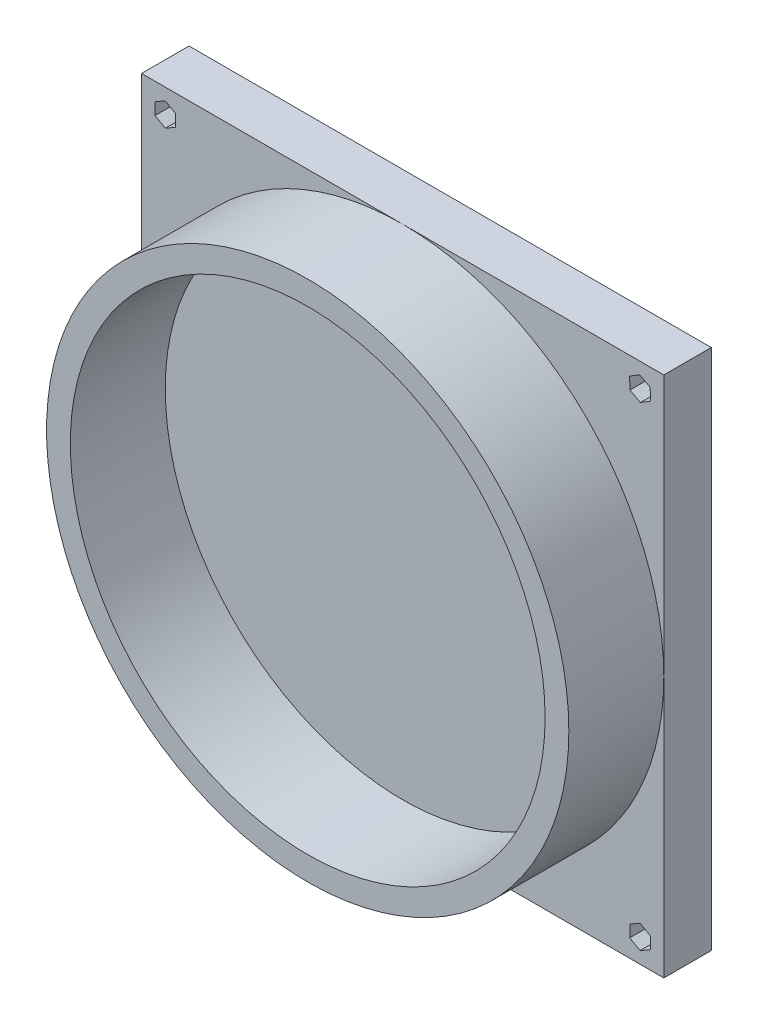
ISO-10303-21;
HEADER;
FILE_DESCRIPTION(('STEP AP214'),'2;1');
FILE_NAME('part.step','',(''),(''),'','','');
FILE_SCHEMA(('AUTOMOTIVE_DESIGN { 1 0 10303 214 1 1 1 1 }'));
ENDSEC;
DATA;
#1=APPLICATION_CONTEXT('core data for automotive mechanical design processes');
#2=APPLICATION_PROTOCOL_DEFINITION('international standard','automotive_design',2000,#1);
#3=PRODUCT_CONTEXT('',#1,'mechanical');
#4=PRODUCT('Part','Part','',(#3));
#5=PRODUCT_RELATED_PRODUCT_CATEGORY('part','',(#4));
#6=PRODUCT_DEFINITION_FORMATION('','',#4);
#7=PRODUCT_DEFINITION_CONTEXT('part definition',#1,'design');
#8=PRODUCT_DEFINITION('design','',#6,#7);
#9=PRODUCT_DEFINITION_SHAPE('','',#8);
#10=(LENGTH_UNIT() NAMED_UNIT(*) SI_UNIT(.MILLI.,.METRE.));
#11=(NAMED_UNIT(*) PLANE_ANGLE_UNIT() SI_UNIT($,.RADIAN.));
#12=(NAMED_UNIT(*) SI_UNIT($,.STERADIAN.) SOLID_ANGLE_UNIT());
#13=UNCERTAINTY_MEASURE_WITH_UNIT(LENGTH_MEASURE(1.E-05),#10,'distance_accuracy_value','');
#14=(GEOMETRIC_REPRESENTATION_CONTEXT(3) GLOBAL_UNCERTAINTY_ASSIGNED_CONTEXT((#13)) GLOBAL_UNIT_ASSIGNED_CONTEXT((#10,
#11,#12)) REPRESENTATION_CONTEXT('',''));
#15=CARTESIAN_POINT('',(0.,0.,0.));
#16=DIRECTION('',(0.,0.,1.));
#17=DIRECTION('',(1.,0.,0.));
#18=AXIS2_PLACEMENT_3D('',#15,#16,#17);
#19=CARTESIAN_POINT('',(0.,0.,10.));
#20=DIRECTION('',(0.,0.,-1.));
#21=DIRECTION('',(-1.,0.,0.));
#22=AXIS2_PLACEMENT_3D('',#19,#20,#21);
#23=PLANE('',#22);
#24=DIRECTION('',(0.,-1.,0.));
#25=VECTOR('',#24,1.);
#26=CARTESIAN_POINT('',(-55.,55.,10.));
#27=LINE('',#26,#25);
#28=CARTESIAN_POINT('',(-55.,55.,10.));
#29=VERTEX_POINT('',#28);
#30=CARTESIAN_POINT('',(-55.,0.,10.));
#31=VERTEX_POINT('',#30);
#32=EDGE_CURVE('E429',#29,#31,#27,.T.);
#33=ORIENTED_EDGE('',*,*,#32,.T.);
#34=CARTESIAN_POINT('',(0.,0.,10.));
#35=DIRECTION('',(0.,0.,-1.));
#36=DIRECTION('',(-1.,0.,0.));
#37=AXIS2_PLACEMENT_3D('',#34,#35,#36);
#38=CIRCLE('',#37,55.);
#39=CARTESIAN_POINT('',(0.,55.,10.));
#40=VERTEX_POINT('',#39);
#41=EDGE_CURVE('E463',#31,#40,#38,.T.);
#42=ORIENTED_EDGE('',*,*,#41,.T.);
#43=DIRECTION('',(-1.,0.,0.));
#44=VECTOR('',#43,1.);
#45=CARTESIAN_POINT('',(55.,55.,10.));
#46=LINE('',#45,#44);
#47=EDGE_CURVE('E423',#40,#29,#46,.T.);
#48=ORIENTED_EDGE('',*,*,#47,.T.);
#49=EDGE_LOOP('',(#33,#42,#48));
#50=FACE_BOUND('',#49,.T.);
#51=DIRECTION('',(0.862744918443817,0.505639402835036,0.));
#52=VECTOR('',#51,1.);
#53=CARTESIAN_POINT('',(-33.5007101329894,57.1604334421804,10.));
#54=LINE('',#53,#52);
#55=CARTESIAN_POINT('',(-49.983689728031,47.5000532055605,10.));
#56=VERTEX_POINT('',#55);
#57=CARTESIAN_POINT('',(-47.8268274319214,48.7641517126481,10.));
#58=VERTEX_POINT('',#57);
#59=EDGE_CURVE('E380',#56,#58,#54,.T.);
#60=ORIENTED_EDGE('',*,*,#59,.F.);
#61=DIRECTION('',(0.869269027231443,-0.494339314940762,0.));
#62=VECTOR('',#61,1.);
#63=CARTESIAN_POINT('',(8.19684884416536,14.4137166633907,10.));
#64=LINE('',#63,#62);
#65=CARTESIAN_POINT('',(-52.1568622961096,48.7359014929124,10.));
#66=VERTEX_POINT('',#65);
#67=EDGE_CURVE('E370',#66,#56,#64,.T.);
#68=ORIENTED_EDGE('',*,*,#67,.F.);
#69=DIRECTION('',(0.00652410878762558,-0.999978717775797,0.));
#70=VECTOR('',#69,1.);
#71=CARTESIAN_POINT('',(-51.8366907353165,-0.338195407098186,10.));
#72=LINE('',#71,#70);
#73=CARTESIAN_POINT('',(-52.1731725680786,51.2358482873519,10.));
#74=VERTEX_POINT('',#73);
#75=EDGE_CURVE('E372',#74,#66,#72,.T.);
#76=ORIENTED_EDGE('',*,*,#75,.F.);
#77=DIRECTION('',(-0.862744918443817,-0.505639402835036,0.));
#78=VECTOR('',#77,1.);
#79=CARTESIAN_POINT('',(-35.6901929730371,60.8962285239718,10.));
#80=LINE('',#79,#78);
#81=CARTESIAN_POINT('',(-50.0163102719691,52.4999467944395,10.));
#82=VERTEX_POINT('',#81);
#83=EDGE_CURVE('E374',#82,#74,#80,.T.);
#84=ORIENTED_EDGE('',*,*,#83,.F.);
#85=DIRECTION('',(-0.869269027231443,0.494339314940762,0.));
#86=VECTOR('',#85,1.);
#87=CARTESIAN_POINT('',(10.3374008683058,18.1777619649178,10.));
#88=LINE('',#87,#86);
#89=CARTESIAN_POINT('',(-47.8431377038905,51.2640985070876,10.));
#90=VERTEX_POINT('',#89);
#91=EDGE_CURVE('E376',#90,#82,#88,.T.);
#92=ORIENTED_EDGE('',*,*,#91,.F.);
#93=DIRECTION('',(-0.00652410878762561,0.999978717775797,0.));
#94=VECTOR('',#93,1.);
#95=CARTESIAN_POINT('',(-47.5066558711283,-0.309945187362502,10.));
#96=LINE('',#95,#94);
#97=EDGE_CURVE('E378',#58,#90,#96,.T.);
#98=ORIENTED_EDGE('',*,*,#97,.F.);
#99=EDGE_LOOP('',(#60,#68,#76,#84,#92,#98));
#100=FACE_BOUND('',#99,.T.);
#101=ADVANCED_FACE('F38',(#50,#100),#23,.F.);
#102=CARTESIAN_POINT('',(55.,55.,10.));
#103=VERTEX_POINT('',#102);
#104=EDGE_CURVE('E425',#103,#40,#46,.T.);
#105=ORIENTED_EDGE('',*,*,#104,.T.);
#106=CARTESIAN_POINT('',(55.,0.,10.));
#107=VERTEX_POINT('',#106);
#108=EDGE_CURVE('E477',#40,#107,#38,.T.);
#109=ORIENTED_EDGE('',*,*,#108,.T.);
#110=DIRECTION('',(0.,1.,0.));
#111=VECTOR('',#110,1.);
#112=CARTESIAN_POINT('',(55.,55.,10.));
#113=LINE('',#112,#111);
#114=EDGE_CURVE('E424',#107,#103,#113,.T.);
#115=ORIENTED_EDGE('',*,*,#114,.T.);
#116=EDGE_LOOP('',(#105,#109,#115));
#117=FACE_BOUND('',#116,.T.);
#118=DIRECTION('',(0.881695066142599,-0.471819679898791,0.));
#119=VECTOR('',#118,1.);
#120=CARTESIAN_POINT('',(30.9092251387826,57.7604378626201,10.));
#121=LINE('',#120,#119);
#122=CARTESIAN_POINT('',(47.8763615953273,48.6808487856962,10.));
#123=VERTEX_POINT('',#122);
#124=CARTESIAN_POINT('',(50.0805992606837,47.5012995859493,10.));
#125=VERTEX_POINT('',#124);
#126=EDGE_CURVE('E242',#123,#125,#121,.T.);
#127=ORIENTED_EDGE('',*,*,#126,.F.);
#128=DIRECTION('',(0.0322397042735064,-0.999480165620287,0.));
#129=VECTOR('',#128,1.);
#130=CARTESIAN_POINT('',(49.3952392867449,1.59331616764544,10.));
#131=LINE('',#130,#129);
#132=CARTESIAN_POINT('',(47.7957623346435,51.179549199747,10.));
#133=VERTEX_POINT('',#132);
#134=EDGE_CURVE('E382',#133,#123,#131,.T.);
#135=ORIENTED_EDGE('',*,*,#134,.F.);
#136=DIRECTION('',(-0.849455361869095,-0.527660485721496,0.));
#137=VECTOR('',#136,1.);
#138=CARTESIAN_POINT('',(-9.63234049555665,15.5066439551778,10.));
#139=LINE('',#138,#137);
#140=CARTESIAN_POINT('',(49.9194007393163,52.4987004140507,10.));
#141=VERTEX_POINT('',#140);
#142=EDGE_CURVE('E384',#141,#133,#139,.T.);
#143=ORIENTED_EDGE('',*,*,#142,.F.);
#144=DIRECTION('',(-0.8816950661426,0.47181967989879,0.));
#145=VECTOR('',#144,1.);
#146=CARTESIAN_POINT('',(32.9522642827715,61.5782894909746,10.));
#147=LINE('',#146,#145);
#148=CARTESIAN_POINT('',(52.1236384046727,51.3191512143038,10.));
#149=VERTEX_POINT('',#148);
#150=EDGE_CURVE('E386',#149,#141,#147,.T.);
#151=ORIENTED_EDGE('',*,*,#150,.F.);
#152=DIRECTION('',(-0.032239704273504,0.999480165620287,0.));
#153=VECTOR('',#152,1.);
#154=CARTESIAN_POINT('',(53.723115356774,1.73291818220207,10.));
#155=LINE('',#154,#153);
#156=CARTESIAN_POINT('',(52.2042376653565,48.820450800253,10.));
#157=VERTEX_POINT('',#156);
#158=EDGE_CURVE('E388',#157,#149,#155,.T.);
#159=ORIENTED_EDGE('',*,*,#158,.F.);
#160=DIRECTION('',(0.849455361869097,0.527660485721492,0.));
#161=VECTOR('',#160,1.);
#162=CARTESIAN_POINT('',(-7.34750356951653,11.8283943413804,10.));
#163=LINE('',#162,#161);
#164=EDGE_CURVE('E390',#125,#157,#163,.T.);
#165=ORIENTED_EDGE('',*,*,#164,.F.);
#166=EDGE_LOOP('',(#127,#135,#143,#151,#159,#165));
#167=FACE_BOUND('',#166,.T.);
#168=ADVANCED_FACE('F505',(#117,#167),#23,.F.);
#169=CARTESIAN_POINT('',(55.,-55.,10.));
#170=VERTEX_POINT('',#169);
#171=EDGE_CURVE('E420',#170,#107,#113,.T.);
#172=ORIENTED_EDGE('',*,*,#171,.T.);
#173=CARTESIAN_POINT('',(0.,-55.,10.));
#174=VERTEX_POINT('',#173);
#175=EDGE_CURVE('E462',#107,#174,#38,.T.);
#176=ORIENTED_EDGE('',*,*,#175,.T.);
#177=DIRECTION('',(1.,0.,0.));
#178=VECTOR('',#177,1.);
#179=CARTESIAN_POINT('',(55.,-55.,10.));
#180=LINE('',#179,#178);
#181=EDGE_CURVE('E432',#174,#170,#180,.T.);
#182=ORIENTED_EDGE('',*,*,#181,.T.);
#183=EDGE_LOOP('',(#172,#176,#182));
#184=FACE_BOUND('',#183,.T.);
#185=DIRECTION('',(0.866025403784438,0.500000000000001,0.));
#186=VECTOR('',#185,1.);
#187=CARTESIAN_POINT('',(35.2331668493416,-61.025635094611,10.));
#188=LINE('',#187,#186);
#189=CARTESIAN_POINT('',(50.,-52.5,10.));
#190=VERTEX_POINT('',#189);
#191=CARTESIAN_POINT('',(52.1650635094611,-51.25,10.));
#192=VERTEX_POINT('',#191);
#193=EDGE_CURVE('E404',#190,#192,#188,.T.);
#194=ORIENTED_EDGE('',*,*,#193,.F.);
#195=DIRECTION('',(0.866025403784437,-0.500000000000003,0.));
#196=VECTOR('',#195,1.);
#197=CARTESIAN_POINT('',(-10.2331668493415,-17.7243649053888,10.));
#198=LINE('',#197,#196);
#199=CARTESIAN_POINT('',(47.8349364905389,-51.25,10.));
#200=VERTEX_POINT('',#199);
#201=EDGE_CURVE('E393',#200,#190,#198,.T.);
#202=ORIENTED_EDGE('',*,*,#201,.F.);
#203=DIRECTION('',(0.,-1.,0.));
#204=VECTOR('',#203,1.);
#205=CARTESIAN_POINT('',(47.8349364905391,-1.32768619683197E-13,10.));
#206=LINE('',#205,#204);
#207=CARTESIAN_POINT('',(47.8349364905389,-48.75,10.));
#208=VERTEX_POINT('',#207);
#209=EDGE_CURVE('E395',#208,#200,#206,.T.);
#210=ORIENTED_EDGE('',*,*,#209,.F.);
#211=DIRECTION('',(-0.866025403784444,-0.49999999999999,0.));
#212=VECTOR('',#211,1.);
#213=CARTESIAN_POINT('',(33.0681033398796,-57.2756350946112,10.));
#214=LINE('',#213,#212);
#215=CARTESIAN_POINT('',(50.,-47.5,10.));
#216=VERTEX_POINT('',#215);
#217=EDGE_CURVE('E398',#216,#208,#214,.T.);
#218=ORIENTED_EDGE('',*,*,#217,.F.);
#219=DIRECTION('',(-0.866025403784436,0.500000000000005,0.));
#220=VECTOR('',#219,1.);
#221=CARTESIAN_POINT('',(-8.06810333988032,-13.9743649053887,10.));
#222=LINE('',#221,#220);
#223=CARTESIAN_POINT('',(52.1650635094611,-48.75,10.));
#224=VERTEX_POINT('',#223);
#225=EDGE_CURVE('E400',#224,#216,#222,.T.);
#226=ORIENTED_EDGE('',*,*,#225,.F.);
#227=DIRECTION('',(0.,1.,0.));
#228=VECTOR('',#227,1.);
#229=CARTESIAN_POINT('',(52.1650635094611,0.,10.));
#230=LINE('',#229,#228);
#231=EDGE_CURVE('E402',#192,#224,#230,.T.);
#232=ORIENTED_EDGE('',*,*,#231,.F.);
#233=EDGE_LOOP('',(#194,#202,#210,#218,#226,#232));
#234=FACE_BOUND('',#233,.T.);
#235=ADVANCED_FACE('F501',(#184,#234),#23,.F.);
#236=CARTESIAN_POINT('',(-55.,-55.,10.));
#237=VERTEX_POINT('',#236);
#238=EDGE_CURVE('E433',#237,#174,#180,.T.);
#239=ORIENTED_EDGE('',*,*,#238,.T.);
#240=EDGE_CURVE('E459',#174,#31,#38,.T.);
#241=ORIENTED_EDGE('',*,*,#240,.T.);
#242=EDGE_CURVE('E428',#31,#237,#27,.T.);
#243=ORIENTED_EDGE('',*,*,#242,.T.);
#244=EDGE_LOOP('',(#239,#241,#243));
#245=FACE_BOUND('',#244,.T.);
#246=DIRECTION('',(0.869042604978264,-0.494737254239654,0.));
#247=VECTOR('',#246,1.);
#248=CARTESIAN_POINT('',(-34.806772722766,-61.140672505787,10.));
#249=LINE('',#248,#247);
#250=CARTESIAN_POINT('',(-52.1574408321482,-51.2631108644058,10.));
#251=VERTEX_POINT('',#250);
#252=CARTESIAN_POINT('',(-49.9848343197024,-52.499954000005,10.));
#253=VERTEX_POINT('',#252);
#254=EDGE_CURVE('E417',#251,#253,#249,.T.);
#255=ORIENTED_EDGE('',*,*,#254,.F.);
#256=DIRECTION('',(0.00606627211901795,-0.999981600002009,0.));
#257=VECTOR('',#256,1.);
#258=CARTESIAN_POINT('',(-52.466491714407,-0.318281872255604,10.));
#259=LINE('',#258,#257);
#260=CARTESIAN_POINT('',(-52.1726065124457,-48.7631568644008,10.));
#261=VERTEX_POINT('',#260);
#262=EDGE_CURVE('E406',#261,#251,#259,.T.);
#263=ORIENTED_EDGE('',*,*,#262,.F.);
#264=DIRECTION('',(-0.862976332859241,-0.505244345762342,0.));
#265=VECTOR('',#264,1.);
#266=CARTESIAN_POINT('',(7.94321709258013,-13.5673133507644,10.));
#267=LINE('',#266,#265);
#268=CARTESIAN_POINT('',(-50.0151656802976,-47.5000459999949,10.));
#269=VERTEX_POINT('',#268);
#270=EDGE_CURVE('E408',#269,#261,#267,.T.);
#271=ORIENTED_EDGE('',*,*,#270,.F.);
#272=DIRECTION('',(-0.869042604978258,0.494737254239666,0.));
#273=VECTOR('',#272,1.);
#274=CARTESIAN_POINT('',(-32.6644975709164,-57.3776076413758,10.));
#275=LINE('',#274,#273);
#276=CARTESIAN_POINT('',(-47.8425591678519,-48.7368891355941,10.));
#277=VERTEX_POINT('',#276);
#278=EDGE_CURVE('E411',#277,#269,#275,.T.);
#279=ORIENTED_EDGE('',*,*,#278,.F.);
#280=DIRECTION('',(-0.006066272119043,0.999981600002009,0.));
#281=VECTOR('',#280,1.);
#282=CARTESIAN_POINT('',(-48.1364443698144,-0.292014143450122,10.));
#283=LINE('',#282,#281);
#284=CARTESIAN_POINT('',(-47.8273934875543,-51.2368431355991,10.));
#285=VERTEX_POINT('',#284);
#286=EDGE_CURVE('E413',#285,#277,#283,.T.);
#287=ORIENTED_EDGE('',*,*,#286,.F.);
#288=DIRECTION('',(0.862976332859225,0.505244345762368,0.));
#289=VECTOR('',#288,1.);
#290=CARTESIAN_POINT('',(10.1309892853228,-17.3041104863665,10.));
#291=LINE('',#290,#289);
#292=EDGE_CURVE('E415',#253,#285,#291,.T.);
#293=ORIENTED_EDGE('',*,*,#292,.F.);
#294=EDGE_LOOP('',(#255,#263,#271,#279,#287,#293));
#295=FACE_BOUND('',#294,.T.);
#296=ADVANCED_FACE('F482',(#245,#295),#23,.F.);
#297=CARTESIAN_POINT('',(0.,0.,0.));
#298=DIRECTION('',(0.,0.,1.));
#299=DIRECTION('',(1.,0.,0.));
#300=AXIS2_PLACEMENT_3D('',#297,#298,#299);
#301=PLANE('',#300);
#302=DIRECTION('',(0.866025403784438,0.500000000000001,0.));
#303=VECTOR('',#302,1.);
#304=CARTESIAN_POINT('',(50.,-52.5,0.));
#305=LINE('',#304,#303);
#306=CARTESIAN_POINT('',(50.,-52.5,0.));
#307=VERTEX_POINT('',#306);
#308=CARTESIAN_POINT('',(52.1650635094611,-51.25,0.));
#309=VERTEX_POINT('',#308);
#310=EDGE_CURVE('E282',#307,#309,#305,.T.);
#311=ORIENTED_EDGE('',*,*,#310,.T.);
#312=DIRECTION('',(0.,1.,0.));
#313=VECTOR('',#312,1.);
#314=CARTESIAN_POINT('',(52.1650635094611,-51.25,0.));
#315=LINE('',#314,#313);
#316=CARTESIAN_POINT('',(52.1650635094611,-48.75,0.));
#317=VERTEX_POINT('',#316);
#318=EDGE_CURVE('E285',#309,#317,#315,.T.);
#319=ORIENTED_EDGE('',*,*,#318,.T.);
#320=DIRECTION('',(-0.866025403784436,0.500000000000004,0.));
#321=VECTOR('',#320,1.);
#322=CARTESIAN_POINT('',(52.1650635094611,-48.75,0.));
#323=LINE('',#322,#321);
#324=CARTESIAN_POINT('',(50.,-47.5,0.));
#325=VERTEX_POINT('',#324);
#326=EDGE_CURVE('E289',#317,#325,#323,.T.);
#327=ORIENTED_EDGE('',*,*,#326,.T.);
#328=DIRECTION('',(-0.866025403784444,-0.49999999999999,0.));
#329=VECTOR('',#328,1.);
#330=CARTESIAN_POINT('',(50.,-47.5,0.));
#331=LINE('',#330,#329);
#332=CARTESIAN_POINT('',(47.8349364905389,-48.75,0.));
#333=VERTEX_POINT('',#332);
#334=EDGE_CURVE('E292',#325,#333,#331,.T.);
#335=ORIENTED_EDGE('',*,*,#334,.T.);
#336=DIRECTION('',(0.,-1.,0.));
#337=VECTOR('',#336,1.);
#338=CARTESIAN_POINT('',(47.8349364905389,-48.75,0.));
#339=LINE('',#338,#337);
#340=CARTESIAN_POINT('',(47.8349364905389,-51.25,0.));
#341=VERTEX_POINT('',#340);
#342=EDGE_CURVE('E295',#333,#341,#339,.T.);
#343=ORIENTED_EDGE('',*,*,#342,.T.);
#344=DIRECTION('',(0.866025403784437,-0.500000000000003,0.));
#345=VECTOR('',#344,1.);
#346=CARTESIAN_POINT('',(47.8349364905389,-51.25,0.));
#347=LINE('',#346,#345);
#348=EDGE_CURVE('E298',#341,#307,#347,.T.);
#349=ORIENTED_EDGE('',*,*,#348,.T.);
#350=EDGE_LOOP('',(#311,#319,#327,#335,#343,#349));
#351=FACE_BOUND('',#350,.T.);
#352=DIRECTION('',(0.862744918443817,0.505639402835036,0.));
#353=VECTOR('',#352,1.);
#354=CARTESIAN_POINT('',(-49.983689728031,47.5000532055605,0.));
#355=LINE('',#354,#353);
#356=CARTESIAN_POINT('',(-49.983689728031,47.5000532055605,0.));
#357=VERTEX_POINT('',#356);
#358=CARTESIAN_POINT('',(-47.8268274319214,48.7641517126481,0.));
#359=VERTEX_POINT('',#358);
#360=EDGE_CURVE('E245',#357,#359,#355,.T.);
#361=ORIENTED_EDGE('',*,*,#360,.T.);
#362=DIRECTION('',(-0.00652410878762561,0.999978717775797,0.));
#363=VECTOR('',#362,1.);
#364=CARTESIAN_POINT('',(-47.8268274319214,48.7641517126481,0.));
#365=LINE('',#364,#363);
#366=CARTESIAN_POINT('',(-47.8431377038905,51.2640985070876,0.));
#367=VERTEX_POINT('',#366);
#368=EDGE_CURVE('E343',#359,#367,#365,.T.);
#369=ORIENTED_EDGE('',*,*,#368,.T.);
#370=DIRECTION('',(-0.869269027231443,0.494339314940762,0.));
#371=VECTOR('',#370,1.);
#372=CARTESIAN_POINT('',(-47.8431377038905,51.2640985070876,0.));
#373=LINE('',#372,#371);
#374=CARTESIAN_POINT('',(-50.0163102719691,52.4999467944395,0.));
#375=VERTEX_POINT('',#374);
#376=EDGE_CURVE('E346',#367,#375,#373,.T.);
#377=ORIENTED_EDGE('',*,*,#376,.T.);
#378=DIRECTION('',(-0.862744918443817,-0.505639402835036,0.));
#379=VECTOR('',#378,1.);
#380=CARTESIAN_POINT('',(-50.0163102719691,52.4999467944395,0.));
#381=LINE('',#380,#379);
#382=CARTESIAN_POINT('',(-52.1731725680786,51.2358482873519,0.));
#383=VERTEX_POINT('',#382);
#384=EDGE_CURVE('E349',#375,#383,#381,.T.);
#385=ORIENTED_EDGE('',*,*,#384,.T.);
#386=DIRECTION('',(0.00652410878762558,-0.999978717775797,0.));
#387=VECTOR('',#386,1.);
#388=CARTESIAN_POINT('',(-52.1731725680786,51.2358482873519,0.));
#389=LINE('',#388,#387);
#390=CARTESIAN_POINT('',(-52.1568622961096,48.7359014929124,0.));
#391=VERTEX_POINT('',#390);
#392=EDGE_CURVE('E352',#383,#391,#389,.T.);
#393=ORIENTED_EDGE('',*,*,#392,.T.);
#394=DIRECTION('',(0.869269027231442,-0.494339314940762,0.));
#395=VECTOR('',#394,1.);
#396=CARTESIAN_POINT('',(-52.1568622961096,48.7359014929124,0.));
#397=LINE('',#396,#395);
#398=EDGE_CURVE('E355',#391,#357,#397,.T.);
#399=ORIENTED_EDGE('',*,*,#398,.T.);
#400=EDGE_LOOP('',(#361,#369,#377,#385,#393,#399));
#401=FACE_BOUND('',#400,.T.);
#402=DIRECTION('',(0.,-1.,0.));
#403=VECTOR('',#402,1.);
#404=CARTESIAN_POINT('',(-55.,55.,0.));
#405=LINE('',#404,#403);
#406=CARTESIAN_POINT('',(-55.,55.,0.));
#407=VERTEX_POINT('',#406);
#408=CARTESIAN_POINT('',(-55.,-55.,0.));
#409=VERTEX_POINT('',#408);
#410=EDGE_CURVE('E442',#407,#409,#405,.T.);
#411=ORIENTED_EDGE('',*,*,#410,.F.);
#412=DIRECTION('',(-1.,0.,0.));
#413=VECTOR('',#412,1.);
#414=CARTESIAN_POINT('',(55.,55.,0.));
#415=LINE('',#414,#413);
#416=CARTESIAN_POINT('',(55.,55.,0.));
#417=VERTEX_POINT('',#416);
#418=EDGE_CURVE('E439',#417,#407,#415,.T.);
#419=ORIENTED_EDGE('',*,*,#418,.F.);
#420=DIRECTION('',(0.,1.,0.));
#421=VECTOR('',#420,1.);
#422=CARTESIAN_POINT('',(55.,55.,0.));
#423=LINE('',#422,#421);
#424=CARTESIAN_POINT('',(55.,-55.,0.));
#425=VERTEX_POINT('',#424);
#426=EDGE_CURVE('E419',#425,#417,#423,.T.);
#427=ORIENTED_EDGE('',*,*,#426,.F.);
#428=DIRECTION('',(1.,0.,0.));
#429=VECTOR('',#428,1.);
#430=CARTESIAN_POINT('',(55.,-55.,0.));
#431=LINE('',#430,#429);
#432=EDGE_CURVE('E445',#409,#425,#431,.T.);
#433=ORIENTED_EDGE('',*,*,#432,.F.);
#434=EDGE_LOOP('',(#411,#419,#427,#433));
#435=FACE_BOUND('',#434,.T.);
#436=DIRECTION('',(0.881695066142599,-0.471819679898791,0.));
#437=VECTOR('',#436,1.);
#438=CARTESIAN_POINT('',(47.8763615953273,48.6808487856962,0.));
#439=LINE('',#438,#437);
#440=CARTESIAN_POINT('',(47.8763615953273,48.6808487856962,0.));
#441=VERTEX_POINT('',#440);
#442=CARTESIAN_POINT('',(50.0805992606837,47.5012995859493,0.));
#443=VERTEX_POINT('',#442);
#444=EDGE_CURVE('E239',#441,#443,#439,.T.);
#445=ORIENTED_EDGE('',*,*,#444,.T.);
#446=DIRECTION('',(0.849455361869097,0.527660485721492,0.));
#447=VECTOR('',#446,1.);
#448=CARTESIAN_POINT('',(50.0805992606837,47.5012995859493,0.));
#449=LINE('',#448,#447);
#450=CARTESIAN_POINT('',(52.2042376653565,48.820450800253,0.));
#451=VERTEX_POINT('',#450);
#452=EDGE_CURVE('E249',#443,#451,#449,.T.);
#453=ORIENTED_EDGE('',*,*,#452,.T.);
#454=DIRECTION('',(-0.032239704273504,0.999480165620287,0.));
#455=VECTOR('',#454,1.);
#456=CARTESIAN_POINT('',(52.2042376653565,48.820450800253,0.));
#457=LINE('',#456,#455);
#458=CARTESIAN_POINT('',(52.1236384046727,51.3191512143038,0.));
#459=VERTEX_POINT('',#458);
#460=EDGE_CURVE('E255',#451,#459,#457,.T.);
#461=ORIENTED_EDGE('',*,*,#460,.T.);
#462=DIRECTION('',(-0.8816950661426,0.47181967989879,0.));
#463=VECTOR('',#462,1.);
#464=CARTESIAN_POINT('',(52.1236384046727,51.3191512143038,0.));
#465=LINE('',#464,#463);
#466=CARTESIAN_POINT('',(49.9194007393163,52.4987004140507,0.));
#467=VERTEX_POINT('',#466);
#468=EDGE_CURVE('E268',#459,#467,#465,.T.);
#469=ORIENTED_EDGE('',*,*,#468,.T.);
#470=DIRECTION('',(-0.849455361869095,-0.527660485721496,0.));
#471=VECTOR('',#470,1.);
#472=CARTESIAN_POINT('',(49.9194007393163,52.4987004140507,0.));
#473=LINE('',#472,#471);
#474=CARTESIAN_POINT('',(47.7957623346435,51.179549199747,0.));
#475=VERTEX_POINT('',#474);
#476=EDGE_CURVE('E271',#467,#475,#473,.T.);
#477=ORIENTED_EDGE('',*,*,#476,.T.);
#478=DIRECTION('',(0.0322397042735064,-0.999480165620287,0.));
#479=VECTOR('',#478,1.);
#480=CARTESIAN_POINT('',(47.7957623346435,51.179549199747,0.));
#481=LINE('',#480,#479);
#482=EDGE_CURVE('E261',#475,#441,#481,.T.);
#483=ORIENTED_EDGE('',*,*,#482,.T.);
#484=EDGE_LOOP('',(#445,#453,#461,#469,#477,#483));
#485=FACE_BOUND('',#484,.T.);
#486=DIRECTION('',(0.869042604978264,-0.494737254239654,0.));
#487=VECTOR('',#486,1.);
#488=CARTESIAN_POINT('',(-52.1574408321482,-51.2631108644058,0.));
#489=LINE('',#488,#487);
#490=CARTESIAN_POINT('',(-52.1574408321482,-51.2631108644058,0.));
#491=VERTEX_POINT('',#490);
#492=CARTESIAN_POINT('',(-49.9848343197024,-52.499954000005,0.));
#493=VERTEX_POINT('',#492);
#494=EDGE_CURVE('E311',#491,#493,#489,.T.);
#495=ORIENTED_EDGE('',*,*,#494,.T.);
#496=DIRECTION('',(0.862976332859225,0.505244345762368,0.));
#497=VECTOR('',#496,1.);
#498=CARTESIAN_POINT('',(-49.9848343197024,-52.499954000005,0.));
#499=LINE('',#498,#497);
#500=CARTESIAN_POINT('',(-47.8273934875543,-51.2368431355991,0.));
#501=VERTEX_POINT('',#500);
#502=EDGE_CURVE('E314',#493,#501,#499,.T.);
#503=ORIENTED_EDGE('',*,*,#502,.T.);
#504=DIRECTION('',(-0.006066272119043,0.999981600002009,0.));
#505=VECTOR('',#504,1.);
#506=CARTESIAN_POINT('',(-47.8273934875543,-51.2368431355991,0.));
#507=LINE('',#506,#505);
#508=CARTESIAN_POINT('',(-47.8425591678519,-48.7368891355941,0.));
#509=VERTEX_POINT('',#508);
#510=EDGE_CURVE('E317',#501,#509,#507,.T.);
#511=ORIENTED_EDGE('',*,*,#510,.T.);
#512=DIRECTION('',(-0.869042604978258,0.494737254239666,0.));
#513=VECTOR('',#512,1.);
#514=CARTESIAN_POINT('',(-47.8425591678519,-48.7368891355941,0.));
#515=LINE('',#514,#513);
#516=CARTESIAN_POINT('',(-50.0151656802976,-47.5000459999949,0.));
#517=VERTEX_POINT('',#516);
#518=EDGE_CURVE('E320',#509,#517,#515,.T.);
#519=ORIENTED_EDGE('',*,*,#518,.T.);
#520=DIRECTION('',(-0.862976332859241,-0.505244345762342,0.));
#521=VECTOR('',#520,1.);
#522=CARTESIAN_POINT('',(-50.0151656802976,-47.5000459999949,0.));
#523=LINE('',#522,#521);
#524=CARTESIAN_POINT('',(-52.1726065124457,-48.7631568644008,0.));
#525=VERTEX_POINT('',#524);
#526=EDGE_CURVE('E323',#517,#525,#523,.T.);
#527=ORIENTED_EDGE('',*,*,#526,.T.);
#528=DIRECTION('',(0.00606627211901795,-0.999981600002009,0.));
#529=VECTOR('',#528,1.);
#530=CARTESIAN_POINT('',(-52.1726065124457,-48.7631568644008,0.));
#531=LINE('',#530,#529);
#532=EDGE_CURVE('E326',#525,#491,#531,.T.);
#533=ORIENTED_EDGE('',*,*,#532,.T.);
#534=EDGE_LOOP('',(#495,#503,#511,#519,#527,#533));
#535=FACE_BOUND('',#534,.T.);
#536=ADVANCED_FACE('F258',(#351,#401,#435,#485,#535),#301,.F.);
#537=CARTESIAN_POINT('',(0.,0.,30.));
#538=DIRECTION('',(0.,0.,-1.));
#539=DIRECTION('',(-1.,0.,0.));
#540=AXIS2_PLACEMENT_3D('',#537,#538,#539);
#541=CYLINDRICAL_SURFACE('',#540,55.);
#542=CARTESIAN_POINT('',(0.,0.,30.));
#543=DIRECTION('',(0.,0.,1.));
#544=DIRECTION('',(1.,0.,0.));
#545=AXIS2_PLACEMENT_3D('',#542,#543,#544);
#546=CIRCLE('',#545,55.);
#547=CARTESIAN_POINT('',(55.,0.,30.));
#548=VERTEX_POINT('',#547);
#549=EDGE_CURVE('E46',#548,#548,#546,.T.);
#550=ORIENTED_EDGE('',*,*,#549,.F.);
#551=EDGE_LOOP('',(#550));
#552=FACE_BOUND('',#551,.T.);
#553=ORIENTED_EDGE('',*,*,#41,.F.);
#554=ORIENTED_EDGE('',*,*,#240,.F.);
#555=ORIENTED_EDGE('',*,*,#175,.F.);
#556=ORIENTED_EDGE('',*,*,#108,.F.);
#557=EDGE_LOOP('',(#553,#554,#555,#556));
#558=FACE_BOUND('',#557,.T.);
#559=ADVANCED_FACE('F40',(#552,#558),#541,.T.);
#560=CARTESIAN_POINT('',(0.,0.,9.));
#561=DIRECTION('',(0.,0.,1.));
#562=DIRECTION('',(1.,0.,0.));
#563=AXIS2_PLACEMENT_3D('',#560,#561,#562);
#564=CYLINDRICAL_SURFACE('',#563,50.);
#565=CARTESIAN_POINT('',(0.,0.,30.));
#566=DIRECTION('',(0.,0.,1.));
#567=DIRECTION('',(1.,0.,0.));
#568=AXIS2_PLACEMENT_3D('',#565,#566,#567);
#569=CIRCLE('',#568,50.);
#570=CARTESIAN_POINT('',(50.,0.,30.));
#571=VERTEX_POINT('',#570);
#572=EDGE_CURVE('E464',#571,#571,#569,.T.);
#573=ORIENTED_EDGE('',*,*,#572,.T.);
#574=EDGE_LOOP('',(#573));
#575=FACE_BOUND('',#574,.T.);
#576=CARTESIAN_POINT('',(0.,0.,10.));
#577=DIRECTION('',(0.,0.,-1.));
#578=DIRECTION('',(-1.,0.,0.));
#579=AXIS2_PLACEMENT_3D('',#576,#577,#578);
#580=CIRCLE('',#579,50.);
#581=CARTESIAN_POINT('',(-50.,0.,10.));
#582=VERTEX_POINT('',#581);
#583=EDGE_CURVE('E11',#582,#582,#580,.F.);
#584=ORIENTED_EDGE('',*,*,#583,.F.);
#585=EDGE_LOOP('',(#584));
#586=FACE_BOUND('',#585,.T.);
#587=ADVANCED_FACE('F473',(#575,#586),#564,.F.);
#588=CARTESIAN_POINT('',(0.,0.,30.));
#589=DIRECTION('',(0.,0.,1.));
#590=DIRECTION('',(1.,0.,0.));
#591=AXIS2_PLACEMENT_3D('',#588,#589,#590);
#592=PLANE('',#591);
#593=ORIENTED_EDGE('',*,*,#572,.F.);
#594=EDGE_LOOP('',(#593));
#595=FACE_BOUND('',#594,.T.);
#596=ORIENTED_EDGE('',*,*,#549,.T.);
#597=EDGE_LOOP('',(#596));
#598=FACE_BOUND('',#597,.T.);
#599=ADVANCED_FACE('F469',(#595,#598),#592,.T.);
#600=ORIENTED_EDGE('',*,*,#583,.T.);
#601=EDGE_LOOP('',(#600));
#602=FACE_BOUND('',#601,.T.);
#603=ADVANCED_FACE('F516',(#602),#23,.F.);
#604=CARTESIAN_POINT('',(55.,55.,10.));
#605=DIRECTION('',(-1.,0.,0.));
#606=DIRECTION('',(0.,-1.,0.));
#607=AXIS2_PLACEMENT_3D('',#604,#605,#606);
#608=PLANE('',#607);
#609=ORIENTED_EDGE('',*,*,#114,.F.);
#610=ORIENTED_EDGE('',*,*,#171,.F.);
#611=DIRECTION('',(0.,0.,-1.));
#612=VECTOR('',#611,1.);
#613=CARTESIAN_POINT('',(55.,-55.,10.));
#614=LINE('',#613,#612);
#615=EDGE_CURVE('E436',#170,#425,#614,.T.);
#616=ORIENTED_EDGE('',*,*,#615,.T.);
#617=ORIENTED_EDGE('',*,*,#426,.T.);
#618=DIRECTION('',(0.,0.,-1.));
#619=VECTOR('',#618,1.);
#620=CARTESIAN_POINT('',(55.,55.,10.));
#621=LINE('',#620,#619);
#622=EDGE_CURVE('E456',#103,#417,#621,.T.);
#623=ORIENTED_EDGE('',*,*,#622,.F.);
#624=EDGE_LOOP('',(#609,#610,#616,#617,#623));
#625=FACE_BOUND('',#624,.T.);
#626=ADVANCED_FACE('F509',(#625),#608,.F.);
#627=CARTESIAN_POINT('',(55.,55.,10.));
#628=DIRECTION('',(0.,-1.,0.));
#629=DIRECTION('',(1.,0.,0.));
#630=AXIS2_PLACEMENT_3D('',#627,#628,#629);
#631=PLANE('',#630);
#632=ORIENTED_EDGE('',*,*,#47,.F.);
#633=ORIENTED_EDGE('',*,*,#104,.F.);
#634=ORIENTED_EDGE('',*,*,#622,.T.);
#635=ORIENTED_EDGE('',*,*,#418,.T.);
#636=DIRECTION('',(0.,0.,-1.));
#637=VECTOR('',#636,1.);
#638=CARTESIAN_POINT('',(-55.,55.,10.));
#639=LINE('',#638,#637);
#640=EDGE_CURVE('E453',#29,#407,#639,.T.);
#641=ORIENTED_EDGE('',*,*,#640,.F.);
#642=EDGE_LOOP('',(#632,#633,#634,#635,#641));
#643=FACE_BOUND('',#642,.T.);
#644=ADVANCED_FACE('F493',(#643),#631,.F.);
#645=CARTESIAN_POINT('',(-55.,55.,10.));
#646=DIRECTION('',(1.,0.,0.));
#647=DIRECTION('',(0.,1.,0.));
#648=AXIS2_PLACEMENT_3D('',#645,#646,#647);
#649=PLANE('',#648);
#650=ORIENTED_EDGE('',*,*,#242,.F.);
#651=ORIENTED_EDGE('',*,*,#32,.F.);
#652=ORIENTED_EDGE('',*,*,#640,.T.);
#653=ORIENTED_EDGE('',*,*,#410,.T.);
#654=DIRECTION('',(0.,0.,-1.));
#655=VECTOR('',#654,1.);
#656=CARTESIAN_POINT('',(-55.,-55.,10.));
#657=LINE('',#656,#655);
#658=EDGE_CURVE('E450',#237,#409,#657,.T.);
#659=ORIENTED_EDGE('',*,*,#658,.F.);
#660=EDGE_LOOP('',(#650,#651,#652,#653,#659));
#661=FACE_BOUND('',#660,.T.);
#662=ADVANCED_FACE('F488',(#661),#649,.F.);
#663=CARTESIAN_POINT('',(55.,-55.,10.));
#664=DIRECTION('',(0.,1.,0.));
#665=DIRECTION('',(-1.,0.,0.));
#666=AXIS2_PLACEMENT_3D('',#663,#664,#665);
#667=PLANE('',#666);
#668=ORIENTED_EDGE('',*,*,#181,.F.);
#669=ORIENTED_EDGE('',*,*,#238,.F.);
#670=ORIENTED_EDGE('',*,*,#658,.T.);
#671=ORIENTED_EDGE('',*,*,#432,.T.);
#672=ORIENTED_EDGE('',*,*,#615,.F.);
#673=EDGE_LOOP('',(#668,#669,#670,#671,#672));
#674=FACE_BOUND('',#673,.T.);
#675=ADVANCED_FACE('F497',(#674),#667,.F.);
#676=CARTESIAN_POINT('',(-49.983689728031,47.5000532055605,23.));
#677=DIRECTION('',(-0.505639402835036,0.862744918443817,0.));
#678=DIRECTION('',(-0.862744918443817,-0.505639402835036,0.));
#679=AXIS2_PLACEMENT_3D('',#676,#677,#678);
#680=PLANE('',#679);
#681=ORIENTED_EDGE('',*,*,#59,.T.);
#682=DIRECTION('',(0.,0.,-1.));
#683=VECTOR('',#682,1.);
#684=CARTESIAN_POINT('',(-47.8268274319214,48.7641517126481,23.));
#685=LINE('',#684,#683);
#686=EDGE_CURVE('E368',#58,#359,#685,.T.);
#687=ORIENTED_EDGE('',*,*,#686,.T.);
#688=ORIENTED_EDGE('',*,*,#360,.F.);
#689=DIRECTION('',(0.,0.,-1.));
#690=VECTOR('',#689,1.);
#691=CARTESIAN_POINT('',(-49.983689728031,47.5000532055605,23.));
#692=LINE('',#691,#690);
#693=EDGE_CURVE('E358',#56,#357,#692,.T.);
#694=ORIENTED_EDGE('',*,*,#693,.F.);
#695=EDGE_LOOP('',(#681,#687,#688,#694));
#696=FACE_BOUND('',#695,.T.);
#697=ADVANCED_FACE('F545',(#696),#680,.T.);
#698=CARTESIAN_POINT('',(-47.8268274319214,48.7641517126481,23.));
#699=DIRECTION('',(-0.999978717775797,-0.00652410878762561,0.));
#700=DIRECTION('',(0.00652410878762561,-0.999978717775797,0.));
#701=AXIS2_PLACEMENT_3D('',#698,#699,#700);
#702=PLANE('',#701);
#703=ORIENTED_EDGE('',*,*,#97,.T.);
#704=DIRECTION('',(0.,0.,-1.));
#705=VECTOR('',#704,1.);
#706=CARTESIAN_POINT('',(-47.8431377038905,51.2640985070876,23.));
#707=LINE('',#706,#705);
#708=EDGE_CURVE('E366',#90,#367,#707,.T.);
#709=ORIENTED_EDGE('',*,*,#708,.T.);
#710=ORIENTED_EDGE('',*,*,#368,.F.);
#711=ORIENTED_EDGE('',*,*,#686,.F.);
#712=EDGE_LOOP('',(#703,#709,#710,#711));
#713=FACE_BOUND('',#712,.T.);
#714=ADVANCED_FACE('F549',(#713),#702,.T.);
#715=CARTESIAN_POINT('',(-47.8431377038905,51.2640985070876,23.));
#716=DIRECTION('',(-0.494339314940762,-0.869269027231443,0.));
#717=DIRECTION('',(0.869269027231443,-0.494339314940762,0.));
#718=AXIS2_PLACEMENT_3D('',#715,#716,#717);
#719=PLANE('',#718);
#720=ORIENTED_EDGE('',*,*,#91,.T.);
#721=DIRECTION('',(0.,0.,-1.));
#722=VECTOR('',#721,1.);
#723=CARTESIAN_POINT('',(-50.0163102719691,52.4999467944395,23.));
#724=LINE('',#723,#722);
#725=EDGE_CURVE('E364',#82,#375,#724,.T.);
#726=ORIENTED_EDGE('',*,*,#725,.T.);
#727=ORIENTED_EDGE('',*,*,#376,.F.);
#728=ORIENTED_EDGE('',*,*,#708,.F.);
#729=EDGE_LOOP('',(#720,#726,#727,#728));
#730=FACE_BOUND('',#729,.T.);
#731=ADVANCED_FACE('F554',(#730),#719,.T.);
#732=CARTESIAN_POINT('',(-50.0163102719691,52.4999467944395,23.));
#733=DIRECTION('',(0.505639402835036,-0.862744918443817,0.));
#734=DIRECTION('',(0.862744918443817,0.505639402835036,0.));
#735=AXIS2_PLACEMENT_3D('',#732,#733,#734);
#736=PLANE('',#735);
#737=ORIENTED_EDGE('',*,*,#83,.T.);
#738=DIRECTION('',(0.,0.,-1.));
#739=VECTOR('',#738,1.);
#740=CARTESIAN_POINT('',(-52.1731725680786,51.2358482873519,23.));
#741=LINE('',#740,#739);
#742=EDGE_CURVE('E362',#74,#383,#741,.T.);
#743=ORIENTED_EDGE('',*,*,#742,.T.);
#744=ORIENTED_EDGE('',*,*,#384,.F.);
#745=ORIENTED_EDGE('',*,*,#725,.F.);
#746=EDGE_LOOP('',(#737,#743,#744,#745));
#747=FACE_BOUND('',#746,.T.);
#748=ADVANCED_FACE('F560',(#747),#736,.T.);
#749=CARTESIAN_POINT('',(-52.1731725680786,51.2358482873519,23.));
#750=DIRECTION('',(0.999978717775797,0.00652410878762558,0.));
#751=DIRECTION('',(-0.00652410878762558,0.999978717775797,0.));
#752=AXIS2_PLACEMENT_3D('',#749,#750,#751);
#753=PLANE('',#752);
#754=ORIENTED_EDGE('',*,*,#75,.T.);
#755=DIRECTION('',(0.,0.,-1.));
#756=VECTOR('',#755,1.);
#757=CARTESIAN_POINT('',(-52.1568622961096,48.7359014929124,23.));
#758=LINE('',#757,#756);
#759=EDGE_CURVE('E53',#66,#391,#758,.T.);
#760=ORIENTED_EDGE('',*,*,#759,.T.);
#761=ORIENTED_EDGE('',*,*,#392,.F.);
#762=ORIENTED_EDGE('',*,*,#742,.F.);
#763=EDGE_LOOP('',(#754,#760,#761,#762));
#764=FACE_BOUND('',#763,.T.);
#765=ADVANCED_FACE('F564',(#764),#753,.T.);
#766=CARTESIAN_POINT('',(-52.1568622961096,48.7359014929124,23.));
#767=DIRECTION('',(0.494339314940762,0.869269027231443,0.));
#768=DIRECTION('',(-0.869269027231443,0.494339314940762,0.));
#769=AXIS2_PLACEMENT_3D('',#766,#767,#768);
#770=PLANE('',#769);
#771=ORIENTED_EDGE('',*,*,#67,.T.);
#772=ORIENTED_EDGE('',*,*,#693,.T.);
#773=ORIENTED_EDGE('',*,*,#398,.F.);
#774=ORIENTED_EDGE('',*,*,#759,.F.);
#775=EDGE_LOOP('',(#771,#772,#773,#774));
#776=FACE_BOUND('',#775,.T.);
#777=ADVANCED_FACE('F568',(#776),#770,.T.);
#778=CARTESIAN_POINT('',(47.8763615953273,48.6808487856962,23.));
#779=DIRECTION('',(0.471819679898791,0.881695066142599,0.));
#780=DIRECTION('',(-0.881695066142599,0.471819679898791,0.));
#781=AXIS2_PLACEMENT_3D('',#778,#779,#780);
#782=PLANE('',#781);
#783=ORIENTED_EDGE('',*,*,#126,.T.);
#784=DIRECTION('',(0.,0.,-1.));
#785=VECTOR('',#784,1.);
#786=CARTESIAN_POINT('',(50.0805992606837,47.5012995859493,23.));
#787=LINE('',#786,#785);
#788=EDGE_CURVE('E234',#125,#443,#787,.T.);
#789=ORIENTED_EDGE('',*,*,#788,.T.);
#790=ORIENTED_EDGE('',*,*,#444,.F.);
#791=DIRECTION('',(0.,0.,-1.));
#792=VECTOR('',#791,1.);
#793=CARTESIAN_POINT('',(47.8763615953273,48.6808487856962,23.));
#794=LINE('',#793,#792);
#795=EDGE_CURVE('E274',#123,#441,#794,.T.);
#796=ORIENTED_EDGE('',*,*,#795,.F.);
#797=EDGE_LOOP('',(#783,#789,#790,#796));
#798=FACE_BOUND('',#797,.T.);
#799=ADVANCED_FACE('F236',(#798),#782,.T.);
#800=CARTESIAN_POINT('',(50.0805992606837,47.5012995859493,23.));
#801=DIRECTION('',(-0.527660485721492,0.849455361869097,0.));
#802=DIRECTION('',(-0.849455361869097,-0.527660485721492,0.));
#803=AXIS2_PLACEMENT_3D('',#800,#801,#802);
#804=PLANE('',#803);
#805=ORIENTED_EDGE('',*,*,#164,.T.);
#806=DIRECTION('',(0.,0.,-1.));
#807=VECTOR('',#806,1.);
#808=CARTESIAN_POINT('',(52.2042376653565,48.820450800253,23.));
#809=LINE('',#808,#807);
#810=EDGE_CURVE('E246',#157,#451,#809,.T.);
#811=ORIENTED_EDGE('',*,*,#810,.T.);
#812=ORIENTED_EDGE('',*,*,#452,.F.);
#813=ORIENTED_EDGE('',*,*,#788,.F.);
#814=EDGE_LOOP('',(#805,#811,#812,#813));
#815=FACE_BOUND('',#814,.T.);
#816=ADVANCED_FACE('F250',(#815),#804,.T.);
#817=CARTESIAN_POINT('',(52.2042376653565,48.820450800253,23.));
#818=DIRECTION('',(-0.999480165620287,-0.032239704273504,0.));
#819=DIRECTION('',(0.032239704273504,-0.999480165620287,0.));
#820=AXIS2_PLACEMENT_3D('',#817,#818,#819);
#821=PLANE('',#820);
#822=ORIENTED_EDGE('',*,*,#158,.T.);
#823=DIRECTION('',(0.,0.,-1.));
#824=VECTOR('',#823,1.);
#825=CARTESIAN_POINT('',(52.1236384046727,51.3191512143038,23.));
#826=LINE('',#825,#824);
#827=EDGE_CURVE('E279',#149,#459,#826,.T.);
#828=ORIENTED_EDGE('',*,*,#827,.T.);
#829=ORIENTED_EDGE('',*,*,#460,.F.);
#830=ORIENTED_EDGE('',*,*,#810,.F.);
#831=EDGE_LOOP('',(#822,#828,#829,#830));
#832=FACE_BOUND('',#831,.T.);
#833=ADVANCED_FACE('F625',(#832),#821,.T.);
#834=CARTESIAN_POINT('',(52.1236384046727,51.3191512143038,23.));
#835=DIRECTION('',(-0.47181967989879,-0.8816950661426,0.));
#836=DIRECTION('',(0.8816950661426,-0.47181967989879,0.));
#837=AXIS2_PLACEMENT_3D('',#834,#835,#836);
#838=PLANE('',#837);
#839=ORIENTED_EDGE('',*,*,#150,.T.);
#840=DIRECTION('',(0.,0.,-1.));
#841=VECTOR('',#840,1.);
#842=CARTESIAN_POINT('',(49.9194007393163,52.4987004140507,23.));
#843=LINE('',#842,#841);
#844=EDGE_CURVE('E277',#141,#467,#843,.T.);
#845=ORIENTED_EDGE('',*,*,#844,.T.);
#846=ORIENTED_EDGE('',*,*,#468,.F.);
#847=ORIENTED_EDGE('',*,*,#827,.F.);
#848=EDGE_LOOP('',(#839,#845,#846,#847));
#849=FACE_BOUND('',#848,.T.);
#850=ADVANCED_FACE('F628',(#849),#838,.T.);
#851=CARTESIAN_POINT('',(49.9194007393163,52.4987004140507,23.));
#852=DIRECTION('',(0.527660485721496,-0.849455361869095,0.));
#853=DIRECTION('',(0.849455361869095,0.527660485721496,0.));
#854=AXIS2_PLACEMENT_3D('',#851,#852,#853);
#855=PLANE('',#854);
#856=ORIENTED_EDGE('',*,*,#142,.T.);
#857=DIRECTION('',(0.,0.,-1.));
#858=VECTOR('',#857,1.);
#859=CARTESIAN_POINT('',(47.7957623346435,51.179549199747,23.));
#860=LINE('',#859,#858);
#861=EDGE_CURVE('E61',#133,#475,#860,.T.);
#862=ORIENTED_EDGE('',*,*,#861,.T.);
#863=ORIENTED_EDGE('',*,*,#476,.F.);
#864=ORIENTED_EDGE('',*,*,#844,.F.);
#865=EDGE_LOOP('',(#856,#862,#863,#864));
#866=FACE_BOUND('',#865,.T.);
#867=ADVANCED_FACE('F632',(#866),#855,.T.);
#868=CARTESIAN_POINT('',(47.7957623346435,51.179549199747,23.));
#869=DIRECTION('',(0.999480165620287,0.0322397042735064,0.));
#870=DIRECTION('',(-0.0322397042735064,0.999480165620287,0.));
#871=AXIS2_PLACEMENT_3D('',#868,#869,#870);
#872=PLANE('',#871);
#873=ORIENTED_EDGE('',*,*,#134,.T.);
#874=ORIENTED_EDGE('',*,*,#795,.T.);
#875=ORIENTED_EDGE('',*,*,#482,.F.);
#876=ORIENTED_EDGE('',*,*,#861,.F.);
#877=EDGE_LOOP('',(#873,#874,#875,#876));
#878=FACE_BOUND('',#877,.T.);
#879=ADVANCED_FACE('F601',(#878),#872,.T.);
#880=CARTESIAN_POINT('',(50.,-52.5,23.));
#881=DIRECTION('',(-0.500000000000001,0.866025403784438,0.));
#882=DIRECTION('',(-0.866025403784438,-0.500000000000001,0.));
#883=AXIS2_PLACEMENT_3D('',#880,#881,#882);
#884=PLANE('',#883);
#885=ORIENTED_EDGE('',*,*,#193,.T.);
#886=DIRECTION('',(0.,0.,-1.));
#887=VECTOR('',#886,1.);
#888=CARTESIAN_POINT('',(52.1650635094611,-51.25,23.));
#889=LINE('',#888,#887);
#890=EDGE_CURVE('E262',#192,#309,#889,.T.);
#891=ORIENTED_EDGE('',*,*,#890,.T.);
#892=ORIENTED_EDGE('',*,*,#310,.F.);
#893=DIRECTION('',(0.,0.,-1.));
#894=VECTOR('',#893,1.);
#895=CARTESIAN_POINT('',(50.,-52.5,23.));
#896=LINE('',#895,#894);
#897=EDGE_CURVE('E301',#190,#307,#896,.T.);
#898=ORIENTED_EDGE('',*,*,#897,.F.);
#899=EDGE_LOOP('',(#885,#891,#892,#898));
#900=FACE_BOUND('',#899,.T.);
#901=ADVANCED_FACE('F597',(#900),#884,.T.);
#902=CARTESIAN_POINT('',(52.1650635094611,-51.25,23.));
#903=DIRECTION('',(-1.,0.,0.));
#904=DIRECTION('',(0.,0.,1.));
#905=AXIS2_PLACEMENT_3D('',#902,#903,#904);
#906=PLANE('',#905);
#907=ORIENTED_EDGE('',*,*,#231,.T.);
#908=DIRECTION('',(0.,0.,-1.));
#909=VECTOR('',#908,1.);
#910=CARTESIAN_POINT('',(52.1650635094611,-48.75,23.));
#911=LINE('',#910,#909);
#912=EDGE_CURVE('E264',#224,#317,#911,.T.);
#913=ORIENTED_EDGE('',*,*,#912,.T.);
#914=ORIENTED_EDGE('',*,*,#318,.F.);
#915=ORIENTED_EDGE('',*,*,#890,.F.);
#916=EDGE_LOOP('',(#907,#913,#914,#915));
#917=FACE_BOUND('',#916,.T.);
#918=ADVANCED_FACE('F600',(#917),#906,.T.);
#919=CARTESIAN_POINT('',(52.1650635094611,-48.75,23.));
#920=DIRECTION('',(-0.500000000000005,-0.866025403784436,0.));
#921=DIRECTION('',(0.866025403784436,-0.500000000000005,0.));
#922=AXIS2_PLACEMENT_3D('',#919,#920,#921);
#923=PLANE('',#922);
#924=ORIENTED_EDGE('',*,*,#225,.T.);
#925=DIRECTION('',(0.,0.,-1.));
#926=VECTOR('',#925,1.);
#927=CARTESIAN_POINT('',(50.,-47.5,23.));
#928=LINE('',#927,#926);
#929=EDGE_CURVE('E308',#216,#325,#928,.T.);
#930=ORIENTED_EDGE('',*,*,#929,.T.);
#931=ORIENTED_EDGE('',*,*,#326,.F.);
#932=ORIENTED_EDGE('',*,*,#912,.F.);
#933=EDGE_LOOP('',(#924,#930,#931,#932));
#934=FACE_BOUND('',#933,.T.);
#935=ADVANCED_FACE('F605',(#934),#923,.T.);
#936=CARTESIAN_POINT('',(50.,-47.5,23.));
#937=DIRECTION('',(0.49999999999999,-0.866025403784444,0.));
#938=DIRECTION('',(0.866025403784444,0.49999999999999,0.));
#939=AXIS2_PLACEMENT_3D('',#936,#937,#938);
#940=PLANE('',#939);
#941=ORIENTED_EDGE('',*,*,#217,.T.);
#942=DIRECTION('',(0.,0.,-1.));
#943=VECTOR('',#942,1.);
#944=CARTESIAN_POINT('',(47.8349364905389,-48.75,23.));
#945=LINE('',#944,#943);
#946=EDGE_CURVE('E306',#208,#333,#945,.T.);
#947=ORIENTED_EDGE('',*,*,#946,.T.);
#948=ORIENTED_EDGE('',*,*,#334,.F.);
#949=ORIENTED_EDGE('',*,*,#929,.F.);
#950=EDGE_LOOP('',(#941,#947,#948,#949));
#951=FACE_BOUND('',#950,.T.);
#952=ADVANCED_FACE('F609',(#951),#940,.T.);
#953=CARTESIAN_POINT('',(47.8349364905389,-48.75,23.));
#954=DIRECTION('',(1.,0.,0.));
#955=DIRECTION('',(0.,1.,0.));
#956=AXIS2_PLACEMENT_3D('',#953,#954,#955);
#957=PLANE('',#956);
#958=ORIENTED_EDGE('',*,*,#209,.T.);
#959=DIRECTION('',(0.,0.,-1.));
#960=VECTOR('',#959,1.);
#961=CARTESIAN_POINT('',(47.8349364905389,-51.25,23.));
#962=LINE('',#961,#960);
#963=EDGE_CURVE('E304',#200,#341,#962,.T.);
#964=ORIENTED_EDGE('',*,*,#963,.T.);
#965=ORIENTED_EDGE('',*,*,#342,.F.);
#966=ORIENTED_EDGE('',*,*,#946,.F.);
#967=EDGE_LOOP('',(#958,#964,#965,#966));
#968=FACE_BOUND('',#967,.T.);
#969=ADVANCED_FACE('F613',(#968),#957,.T.);
#970=CARTESIAN_POINT('',(47.8349364905389,-51.25,23.));
#971=DIRECTION('',(0.500000000000003,0.866025403784437,0.));
#972=DIRECTION('',(-0.866025403784437,0.500000000000003,0.));
#973=AXIS2_PLACEMENT_3D('',#970,#971,#972);
#974=PLANE('',#973);
#975=ORIENTED_EDGE('',*,*,#201,.T.);
#976=ORIENTED_EDGE('',*,*,#897,.T.);
#977=ORIENTED_EDGE('',*,*,#348,.F.);
#978=ORIENTED_EDGE('',*,*,#963,.F.);
#979=EDGE_LOOP('',(#975,#976,#977,#978));
#980=FACE_BOUND('',#979,.T.);
#981=ADVANCED_FACE('F576',(#980),#974,.T.);
#982=CARTESIAN_POINT('',(-52.1574408321482,-51.2631108644058,23.));
#983=DIRECTION('',(0.494737254239654,0.869042604978264,0.));
#984=DIRECTION('',(-0.869042604978264,0.494737254239654,0.));
#985=AXIS2_PLACEMENT_3D('',#982,#983,#984);
#986=PLANE('',#985);
#987=ORIENTED_EDGE('',*,*,#254,.T.);
#988=DIRECTION('',(0.,0.,-1.));
#989=VECTOR('',#988,1.);
#990=CARTESIAN_POINT('',(-49.9848343197024,-52.499954000005,23.));
#991=LINE('',#990,#989);
#992=EDGE_CURVE('E286',#253,#493,#991,.T.);
#993=ORIENTED_EDGE('',*,*,#992,.T.);
#994=ORIENTED_EDGE('',*,*,#494,.F.);
#995=DIRECTION('',(0.,0.,-1.));
#996=VECTOR('',#995,1.);
#997=CARTESIAN_POINT('',(-52.1574408321482,-51.2631108644058,23.));
#998=LINE('',#997,#996);
#999=EDGE_CURVE('E329',#251,#491,#998,.T.);
#1000=ORIENTED_EDGE('',*,*,#999,.F.);
#1001=EDGE_LOOP('',(#987,#993,#994,#1000));
#1002=FACE_BOUND('',#1001,.T.);
#1003=ADVANCED_FACE('F572',(#1002),#986,.T.);
#1004=CARTESIAN_POINT('',(-49.9848343197024,-52.499954000005,23.));
#1005=DIRECTION('',(-0.505244345762368,0.862976332859225,0.));
#1006=DIRECTION('',(-0.862976332859225,-0.505244345762368,0.));
#1007=AXIS2_PLACEMENT_3D('',#1004,#1005,#1006);
#1008=PLANE('',#1007);
#1009=ORIENTED_EDGE('',*,*,#292,.T.);
#1010=DIRECTION('',(0.,0.,-1.));
#1011=VECTOR('',#1010,1.);
#1012=CARTESIAN_POINT('',(-47.8273934875543,-51.2368431355991,23.));
#1013=LINE('',#1012,#1011);
#1014=EDGE_CURVE('E338',#285,#501,#1013,.T.);
#1015=ORIENTED_EDGE('',*,*,#1014,.T.);
#1016=ORIENTED_EDGE('',*,*,#502,.F.);
#1017=ORIENTED_EDGE('',*,*,#992,.F.);
#1018=EDGE_LOOP('',(#1009,#1015,#1016,#1017));
#1019=FACE_BOUND('',#1018,.T.);
#1020=ADVANCED_FACE('F575',(#1019),#1008,.T.);
#1021=CARTESIAN_POINT('',(-47.8273934875543,-51.2368431355991,23.));
#1022=DIRECTION('',(-0.999981600002009,-0.006066272119043,0.));
#1023=DIRECTION('',(0.006066272119043,-0.999981600002009,0.));
#1024=AXIS2_PLACEMENT_3D('',#1021,#1022,#1023);
#1025=PLANE('',#1024);
#1026=ORIENTED_EDGE('',*,*,#286,.T.);
#1027=DIRECTION('',(0.,0.,-1.));
#1028=VECTOR('',#1027,1.);
#1029=CARTESIAN_POINT('',(-47.8425591678519,-48.7368891355941,23.));
#1030=LINE('',#1029,#1028);
#1031=EDGE_CURVE('E336',#277,#509,#1030,.T.);
#1032=ORIENTED_EDGE('',*,*,#1031,.T.);
#1033=ORIENTED_EDGE('',*,*,#510,.F.);
#1034=ORIENTED_EDGE('',*,*,#1014,.F.);
#1035=EDGE_LOOP('',(#1026,#1032,#1033,#1034));
#1036=FACE_BOUND('',#1035,.T.);
#1037=ADVANCED_FACE('F580',(#1036),#1025,.T.);
#1038=CARTESIAN_POINT('',(-47.8425591678519,-48.7368891355941,23.));
#1039=DIRECTION('',(-0.494737254239666,-0.869042604978258,0.));
#1040=DIRECTION('',(0.869042604978258,-0.494737254239666,0.));
#1041=AXIS2_PLACEMENT_3D('',#1038,#1039,#1040);
#1042=PLANE('',#1041);
#1043=ORIENTED_EDGE('',*,*,#278,.T.);
#1044=DIRECTION('',(0.,0.,-1.));
#1045=VECTOR('',#1044,1.);
#1046=CARTESIAN_POINT('',(-50.0151656802976,-47.5000459999949,23.));
#1047=LINE('',#1046,#1045);
#1048=EDGE_CURVE('E334',#269,#517,#1047,.T.);
#1049=ORIENTED_EDGE('',*,*,#1048,.T.);
#1050=ORIENTED_EDGE('',*,*,#518,.F.);
#1051=ORIENTED_EDGE('',*,*,#1031,.F.);
#1052=EDGE_LOOP('',(#1043,#1049,#1050,#1051));
#1053=FACE_BOUND('',#1052,.T.);
#1054=ADVANCED_FACE('F584',(#1053),#1042,.T.);
#1055=CARTESIAN_POINT('',(-50.0151656802976,-47.5000459999949,23.));
#1056=DIRECTION('',(0.505244345762342,-0.862976332859241,0.));
#1057=DIRECTION('',(0.862976332859241,0.505244345762342,0.));
#1058=AXIS2_PLACEMENT_3D('',#1055,#1056,#1057);
#1059=PLANE('',#1058);
#1060=ORIENTED_EDGE('',*,*,#270,.T.);
#1061=DIRECTION('',(0.,0.,-1.));
#1062=VECTOR('',#1061,1.);
#1063=CARTESIAN_POINT('',(-52.1726065124457,-48.7631568644008,23.));
#1064=LINE('',#1063,#1062);
#1065=EDGE_CURVE('E332',#261,#525,#1064,.T.);
#1066=ORIENTED_EDGE('',*,*,#1065,.T.);
#1067=ORIENTED_EDGE('',*,*,#526,.F.);
#1068=ORIENTED_EDGE('',*,*,#1048,.F.);
#1069=EDGE_LOOP('',(#1060,#1066,#1067,#1068));
#1070=FACE_BOUND('',#1069,.T.);
#1071=ADVANCED_FACE('F588',(#1070),#1059,.T.);
#1072=CARTESIAN_POINT('',(-52.1726065124457,-48.7631568644008,23.));
#1073=DIRECTION('',(0.999981600002009,0.00606627211901795,0.));
#1074=DIRECTION('',(-0.00606627211901795,0.999981600002009,0.));
#1075=AXIS2_PLACEMENT_3D('',#1072,#1073,#1074);
#1076=PLANE('',#1075);
#1077=ORIENTED_EDGE('',*,*,#262,.T.);
#1078=ORIENTED_EDGE('',*,*,#999,.T.);
#1079=ORIENTED_EDGE('',*,*,#532,.F.);
#1080=ORIENTED_EDGE('',*,*,#1065,.F.);
#1081=EDGE_LOOP('',(#1077,#1078,#1079,#1080));
#1082=FACE_BOUND('',#1081,.T.);
#1083=ADVANCED_FACE('F592',(#1082),#1076,.T.);
#1084=CLOSED_SHELL('',(#101,#168,#235,#296,#536,#559,#587,#599,#603,#626,#644,#662,#675,#697,
#714,#731,#748,#765,#777,#799,#816,#833,#850,#867,#879,#901,#918,#935,#952,#969,#981,#1003,
#1020,#1037,#1054,#1071,#1083));
#1085=MANIFOLD_SOLID_BREP('B2',#1084);
#1086=ADVANCED_BREP_SHAPE_REPRESENTATION('',(#18,#1085),#14);
#1087=SHAPE_DEFINITION_REPRESENTATION(#9,#1086);
ENDSEC;
END-ISO-10303-21;
